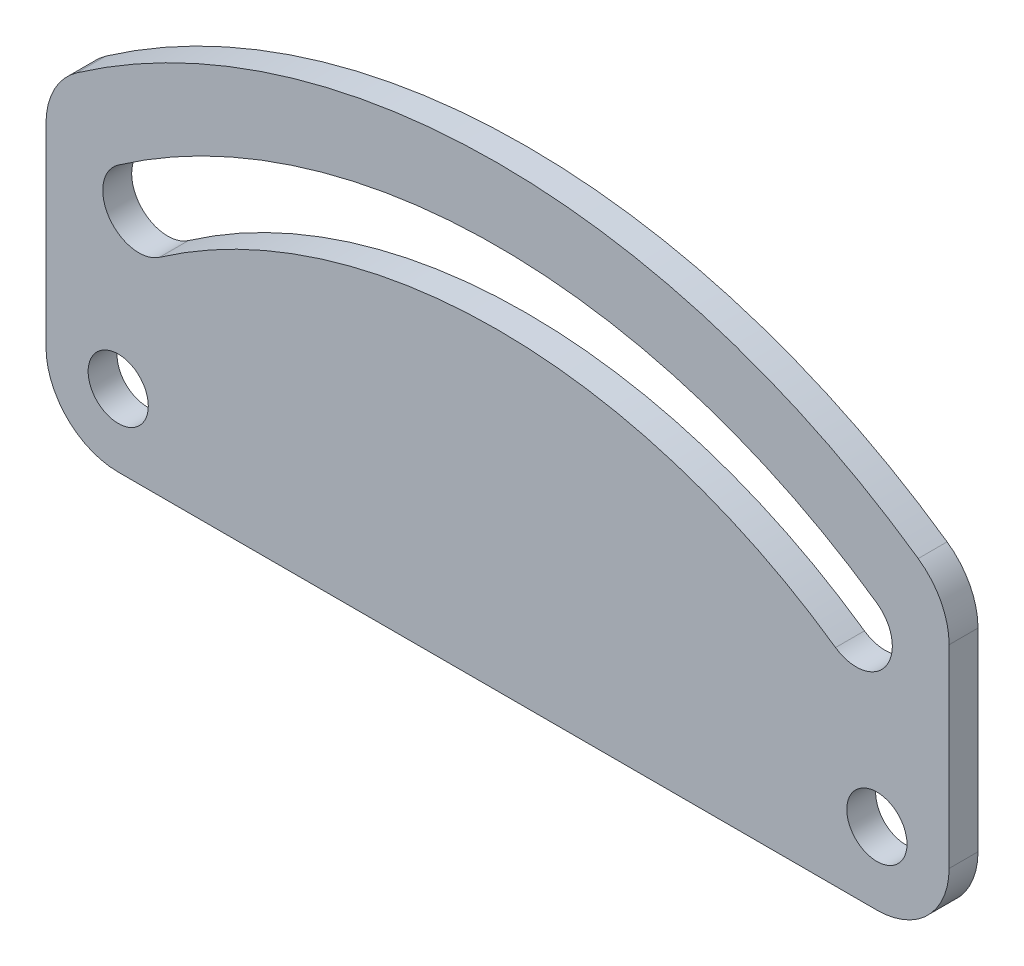
ISO-10303-21;
HEADER;
FILE_DESCRIPTION(('STEP AP214'),'2;1');
FILE_NAME('part.step','',(''),(''),'','','');
FILE_SCHEMA(('AUTOMOTIVE_DESIGN { 1 0 10303 214 1 1 1 1 }'));
ENDSEC;
DATA;
#1=APPLICATION_CONTEXT('core data for automotive mechanical design processes');
#2=APPLICATION_PROTOCOL_DEFINITION('international standard','automotive_design',2000,#1);
#3=PRODUCT_CONTEXT('',#1,'mechanical');
#4=PRODUCT('Part','Part','',(#3));
#5=PRODUCT_RELATED_PRODUCT_CATEGORY('part','',(#4));
#6=PRODUCT_DEFINITION_FORMATION('','',#4);
#7=PRODUCT_DEFINITION_CONTEXT('part definition',#1,'design');
#8=PRODUCT_DEFINITION('design','',#6,#7);
#9=PRODUCT_DEFINITION_SHAPE('','',#8);
#10=(LENGTH_UNIT() NAMED_UNIT(*) SI_UNIT(.MILLI.,.METRE.));
#11=(NAMED_UNIT(*) PLANE_ANGLE_UNIT() SI_UNIT($,.RADIAN.));
#12=(NAMED_UNIT(*) SI_UNIT($,.STERADIAN.) SOLID_ANGLE_UNIT());
#13=UNCERTAINTY_MEASURE_WITH_UNIT(LENGTH_MEASURE(1.E-05),#10,'distance_accuracy_value','');
#14=(GEOMETRIC_REPRESENTATION_CONTEXT(3) GLOBAL_UNCERTAINTY_ASSIGNED_CONTEXT((#13)) GLOBAL_UNIT_ASSIGNED_CONTEXT((#10,
#11,#12)) REPRESENTATION_CONTEXT('',''));
#15=CARTESIAN_POINT('',(0.,0.,0.));
#16=DIRECTION('',(0.,0.,1.));
#17=DIRECTION('',(1.,0.,0.));
#18=AXIS2_PLACEMENT_3D('',#15,#16,#17);
#19=CARTESIAN_POINT('',(73.0572121824321,23.3844748280358,-2.54));
#20=DIRECTION('',(0.,0.,1.));
#21=DIRECTION('',(1.,0.,0.));
#22=AXIS2_PLACEMENT_3D('',#19,#20,#21);
#23=CYLINDRICAL_SURFACE('',#22,6.35);
#24=CARTESIAN_POINT('',(73.0572121824321,23.3844748280358,0.));
#25=DIRECTION('',(0.,0.,1.));
#26=DIRECTION('',(1.,0.,0.));
#27=AXIS2_PLACEMENT_3D('',#24,#25,#26);
#28=CIRCLE('',#27,6.35);
#29=CARTESIAN_POINT('',(79.4072121824321,23.3844748280358,0.));
#30=VERTEX_POINT('',#29);
#31=CARTESIAN_POINT('',(76.6916603062949,28.5915168707843,0.));
#32=VERTEX_POINT('',#31);
#33=EDGE_CURVE('E174',#30,#32,#28,.T.);
#34=ORIENTED_EDGE('',*,*,#33,.F.);
#35=DIRECTION('',(0.,0.,1.));
#36=VECTOR('',#35,1.);
#37=CARTESIAN_POINT('',(79.4072121824321,23.3844748280358,-2.54));
#38=LINE('',#37,#36);
#39=CARTESIAN_POINT('',(79.4072121824321,23.3844748280358,-2.54));
#40=VERTEX_POINT('',#39);
#41=EDGE_CURVE('E11',#40,#30,#38,.T.);
#42=ORIENTED_EDGE('',*,*,#41,.F.);
#43=CARTESIAN_POINT('',(73.0572121824321,23.3844748280358,-2.54));
#44=DIRECTION('',(0.,0.,1.));
#45=DIRECTION('',(1.,0.,0.));
#46=AXIS2_PLACEMENT_3D('',#43,#44,#45);
#47=CIRCLE('',#46,6.35);
#48=CARTESIAN_POINT('',(76.6916603062949,28.5915168707843,-2.54));
#49=VERTEX_POINT('',#48);
#50=EDGE_CURVE('E242',#40,#49,#47,.T.);
#51=ORIENTED_EDGE('',*,*,#50,.T.);
#52=DIRECTION('',(0.,0.,1.));
#53=VECTOR('',#52,1.);
#54=CARTESIAN_POINT('',(76.6916603062949,28.5915168707843,-2.54));
#55=LINE('',#54,#53);
#56=EDGE_CURVE('E211',#49,#32,#55,.T.);
#57=ORIENTED_EDGE('',*,*,#56,.T.);
#58=EDGE_LOOP('',(#34,#42,#51,#57));
#59=FACE_BOUND('',#58,.T.);
#60=ADVANCED_FACE('F33',(#59),#23,.T.);
#61=CARTESIAN_POINT('',(79.4072121824321,-49.2660680671927,-2.54));
#62=DIRECTION('',(1.,0.,0.));
#63=DIRECTION('',(0.,0.,-1.));
#64=AXIS2_PLACEMENT_3D('',#61,#62,#63);
#65=PLANE('',#64);
#66=DIRECTION('',(0.,1.,0.));
#67=VECTOR('',#66,1.);
#68=CARTESIAN_POINT('',(79.4072121824321,-49.2660680671927,0.));
#69=LINE('',#68,#67);
#70=CARTESIAN_POINT('',(79.4072121824321,6.35000000000004,0.));
#71=VERTEX_POINT('',#70);
#72=EDGE_CURVE('E192',#71,#30,#69,.T.);
#73=ORIENTED_EDGE('',*,*,#72,.F.);
#74=DIRECTION('',(0.,0.,1.));
#75=VECTOR('',#74,1.);
#76=CARTESIAN_POINT('',(79.4072121824321,6.35000000000004,-2.54));
#77=LINE('',#76,#75);
#78=CARTESIAN_POINT('',(79.4072121824321,6.35000000000004,-2.54));
#79=VERTEX_POINT('',#78);
#80=EDGE_CURVE('E43',#79,#71,#77,.T.);
#81=ORIENTED_EDGE('',*,*,#80,.F.);
#82=DIRECTION('',(0.,1.,0.));
#83=VECTOR('',#82,1.);
#84=CARTESIAN_POINT('',(79.4072121824321,-49.2660680671927,-2.54));
#85=LINE('',#84,#83);
#86=EDGE_CURVE('E147',#79,#40,#85,.T.);
#87=ORIENTED_EDGE('',*,*,#86,.T.);
#88=ORIENTED_EDGE('',*,*,#41,.T.);
#89=EDGE_LOOP('',(#73,#81,#87,#88));
#90=FACE_BOUND('',#89,.T.);
#91=ADVANCED_FACE('F265',(#90),#65,.T.);
#92=CARTESIAN_POINT('',(73.0572121824321,6.35,-2.54));
#93=DIRECTION('',(0.,0.,1.));
#94=DIRECTION('',(1.,0.,0.));
#95=AXIS2_PLACEMENT_3D('',#92,#93,#94);
#96=CYLINDRICAL_SURFACE('',#95,6.35);
#97=CARTESIAN_POINT('',(73.0572121824321,6.35,0.));
#98=DIRECTION('',(0.,0.,1.));
#99=DIRECTION('',(1.,0.,0.));
#100=AXIS2_PLACEMENT_3D('',#97,#98,#99);
#101=CIRCLE('',#100,6.35);
#102=CARTESIAN_POINT('',(73.057212182432,0.,0.));
#103=VERTEX_POINT('',#102);
#104=EDGE_CURVE('E133',#103,#71,#101,.T.);
#105=ORIENTED_EDGE('',*,*,#104,.F.);
#106=DIRECTION('',(0.,0.,1.));
#107=VECTOR('',#106,1.);
#108=CARTESIAN_POINT('',(73.057212182432,0.,-2.54));
#109=LINE('',#108,#107);
#110=CARTESIAN_POINT('',(73.057212182432,0.,-2.54));
#111=VERTEX_POINT('',#110);
#112=EDGE_CURVE('E128',#111,#103,#109,.T.);
#113=ORIENTED_EDGE('',*,*,#112,.F.);
#114=CARTESIAN_POINT('',(73.0572121824321,6.35,-2.54));
#115=DIRECTION('',(0.,0.,1.));
#116=DIRECTION('',(1.,0.,0.));
#117=AXIS2_PLACEMENT_3D('',#114,#115,#116);
#118=CIRCLE('',#117,6.35);
#119=EDGE_CURVE('E131',#111,#79,#118,.T.);
#120=ORIENTED_EDGE('',*,*,#119,.T.);
#121=ORIENTED_EDGE('',*,*,#80,.T.);
#122=EDGE_LOOP('',(#105,#113,#120,#121));
#123=FACE_BOUND('',#122,.T.);
#124=ADVANCED_FACE('F130',(#123),#96,.T.);
#125=CARTESIAN_POINT('',(39.703606091216,0.,-2.54));
#126=DIRECTION('',(0.,-1.,0.));
#127=DIRECTION('',(0.,0.,-1.));
#128=AXIS2_PLACEMENT_3D('',#125,#126,#127);
#129=PLANE('',#128);
#130=DIRECTION('',(1.,0.,0.));
#131=VECTOR('',#130,1.);
#132=CARTESIAN_POINT('',(39.703606091216,0.,0.));
#133=LINE('',#132,#131);
#134=CARTESIAN_POINT('',(6.35000000000004,0.,0.));
#135=VERTEX_POINT('',#134);
#136=EDGE_CURVE('E189',#135,#103,#133,.T.);
#137=ORIENTED_EDGE('',*,*,#136,.F.);
#138=DIRECTION('',(0.,0.,1.));
#139=VECTOR('',#138,1.);
#140=CARTESIAN_POINT('',(6.35000000000004,0.,-2.54));
#141=LINE('',#140,#139);
#142=CARTESIAN_POINT('',(6.35000000000004,0.,-2.54));
#143=VERTEX_POINT('',#142);
#144=EDGE_CURVE('E138',#143,#135,#141,.T.);
#145=ORIENTED_EDGE('',*,*,#144,.F.);
#146=DIRECTION('',(1.,0.,0.));
#147=VECTOR('',#146,1.);
#148=CARTESIAN_POINT('',(39.703606091216,0.,-2.54));
#149=LINE('',#148,#147);
#150=EDGE_CURVE('E145',#143,#111,#149,.T.);
#151=ORIENTED_EDGE('',*,*,#150,.T.);
#152=ORIENTED_EDGE('',*,*,#112,.T.);
#153=EDGE_LOOP('',(#137,#145,#151,#152));
#154=FACE_BOUND('',#153,.T.);
#155=ADVANCED_FACE('F149',(#154),#129,.T.);
#156=CARTESIAN_POINT('',(6.35,6.35,-2.54));
#157=DIRECTION('',(0.,0.,1.));
#158=DIRECTION('',(1.,0.,0.));
#159=AXIS2_PLACEMENT_3D('',#156,#157,#158);
#160=CYLINDRICAL_SURFACE('',#159,6.35);
#161=CARTESIAN_POINT('',(6.35,6.35,0.));
#162=DIRECTION('',(0.,0.,1.));
#163=DIRECTION('',(1.,0.,0.));
#164=AXIS2_PLACEMENT_3D('',#161,#162,#163);
#165=CIRCLE('',#164,6.35);
#166=CARTESIAN_POINT('',(0.,6.35000000000004,0.));
#167=VERTEX_POINT('',#166);
#168=EDGE_CURVE('E186',#167,#135,#165,.T.);
#169=ORIENTED_EDGE('',*,*,#168,.F.);
#170=DIRECTION('',(0.,0.,1.));
#171=VECTOR('',#170,1.);
#172=CARTESIAN_POINT('',(0.,6.35000000000004,-2.54));
#173=LINE('',#172,#171);
#174=CARTESIAN_POINT('',(0.,6.35000000000004,-2.54));
#175=VERTEX_POINT('',#174);
#176=EDGE_CURVE('E204',#175,#167,#173,.T.);
#177=ORIENTED_EDGE('',*,*,#176,.F.);
#178=CARTESIAN_POINT('',(6.35,6.35,-2.54));
#179=DIRECTION('',(0.,0.,1.));
#180=DIRECTION('',(1.,0.,0.));
#181=AXIS2_PLACEMENT_3D('',#178,#179,#180);
#182=CIRCLE('',#181,6.35);
#183=EDGE_CURVE('E150',#175,#143,#182,.T.);
#184=ORIENTED_EDGE('',*,*,#183,.T.);
#185=ORIENTED_EDGE('',*,*,#144,.T.);
#186=EDGE_LOOP('',(#169,#177,#184,#185));
#187=FACE_BOUND('',#186,.T.);
#188=ADVANCED_FACE('F257',(#187),#160,.T.);
#189=CARTESIAN_POINT('',(0.,-49.2660680671927,-2.54));
#190=DIRECTION('',(-1.,0.,0.));
#191=DIRECTION('',(0.,0.,1.));
#192=AXIS2_PLACEMENT_3D('',#189,#190,#191);
#193=PLANE('',#192);
#194=DIRECTION('',(0.,-1.,0.));
#195=VECTOR('',#194,1.);
#196=CARTESIAN_POINT('',(0.,-49.2660680671927,0.));
#197=LINE('',#196,#195);
#198=CARTESIAN_POINT('',(0.,23.3844748280358,0.));
#199=VERTEX_POINT('',#198);
#200=EDGE_CURVE('E183',#199,#167,#197,.T.);
#201=ORIENTED_EDGE('',*,*,#200,.F.);
#202=DIRECTION('',(0.,0.,1.));
#203=VECTOR('',#202,1.);
#204=CARTESIAN_POINT('',(0.,23.3844748280358,-2.54));
#205=LINE('',#204,#203);
#206=CARTESIAN_POINT('',(0.,23.3844748280358,-2.54));
#207=VERTEX_POINT('',#206);
#208=EDGE_CURVE('E206',#207,#199,#205,.T.);
#209=ORIENTED_EDGE('',*,*,#208,.F.);
#210=DIRECTION('',(0.,-1.,0.));
#211=VECTOR('',#210,1.);
#212=CARTESIAN_POINT('',(0.,-49.2660680671927,-2.54));
#213=LINE('',#212,#211);
#214=EDGE_CURVE('E152',#207,#175,#213,.T.);
#215=ORIENTED_EDGE('',*,*,#214,.T.);
#216=ORIENTED_EDGE('',*,*,#176,.T.);
#217=EDGE_LOOP('',(#201,#209,#215,#216));
#218=FACE_BOUND('',#217,.T.);
#219=ADVANCED_FACE('F252',(#218),#193,.T.);
#220=CARTESIAN_POINT('',(6.35,23.3844748280358,-2.54));
#221=DIRECTION('',(0.,0.,1.));
#222=DIRECTION('',(1.,0.,0.));
#223=AXIS2_PLACEMENT_3D('',#220,#221,#222);
#224=CYLINDRICAL_SURFACE('',#223,6.35);
#225=CARTESIAN_POINT('',(6.35,23.3844748280358,0.));
#226=DIRECTION('',(0.,0.,1.));
#227=DIRECTION('',(1.,0.,0.));
#228=AXIS2_PLACEMENT_3D('',#225,#226,#227);
#229=CIRCLE('',#228,6.35);
#230=CARTESIAN_POINT('',(2.71555187613719,28.5915168707843,0.));
#231=VERTEX_POINT('',#230);
#232=EDGE_CURVE('E180',#199,#231,#229,.F.);
#233=ORIENTED_EDGE('',*,*,#232,.T.);
#234=DIRECTION('',(0.,0.,1.));
#235=VECTOR('',#234,1.);
#236=CARTESIAN_POINT('',(2.71555187613719,28.5915168707843,-2.54));
#237=LINE('',#236,#235);
#238=CARTESIAN_POINT('',(2.71555187613719,28.5915168707843,-2.54));
#239=VERTEX_POINT('',#238);
#240=EDGE_CURVE('E208',#239,#231,#237,.T.);
#241=ORIENTED_EDGE('',*,*,#240,.F.);
#242=CARTESIAN_POINT('',(6.35,23.3844748280358,-2.54));
#243=DIRECTION('',(0.,0.,1.));
#244=DIRECTION('',(1.,0.,0.));
#245=AXIS2_PLACEMENT_3D('',#242,#243,#244);
#246=CIRCLE('',#245,6.35);
#247=EDGE_CURVE('E246',#207,#239,#246,.F.);
#248=ORIENTED_EDGE('',*,*,#247,.F.);
#249=ORIENTED_EDGE('',*,*,#208,.T.);
#250=EDGE_LOOP('',(#233,#241,#248,#249));
#251=FACE_BOUND('',#250,.T.);
#252=ADVANCED_FACE('F261',(#251),#224,.T.);
#253=CARTESIAN_POINT('',(39.703606091216,-24.4009449318279,-2.54));
#254=DIRECTION('',(0.,0.,1.));
#255=DIRECTION('',(1.,0.,0.));
#256=AXIS2_PLACEMENT_3D('',#253,#254,#255);
#257=CYLINDRICAL_SURFACE('',#256,58.2744316224052);
#258=CARTESIAN_POINT('',(39.703606091216,-24.4009449318279,0.));
#259=DIRECTION('',(0.,0.,1.));
#260=DIRECTION('',(1.,0.,0.));
#261=AXIS2_PLACEMENT_3D('',#258,#259,#260);
#262=CIRCLE('',#261,58.2744316224052);
#263=CARTESIAN_POINT('',(6.35,23.3844748280358,0.));
#264=VERTEX_POINT('',#263);
#265=CARTESIAN_POINT('',(73.0572121824321,23.3844748280358,0.));
#266=VERTEX_POINT('',#265);
#267=EDGE_CURVE('E163',#264,#266,#262,.F.);
#268=ORIENTED_EDGE('',*,*,#267,.F.);
#269=DIRECTION('',(0.,0.,1.));
#270=VECTOR('',#269,1.);
#271=CARTESIAN_POINT('',(6.35,23.3844748280358,-2.54));
#272=LINE('',#271,#270);
#273=CARTESIAN_POINT('',(6.35,23.3844748280358,-2.54));
#274=VERTEX_POINT('',#273);
#275=EDGE_CURVE('E213',#274,#264,#272,.T.);
#276=ORIENTED_EDGE('',*,*,#275,.F.);
#277=CARTESIAN_POINT('',(39.703606091216,-24.4009449318279,-2.54));
#278=DIRECTION('',(0.,0.,1.));
#279=DIRECTION('',(1.,0.,0.));
#280=AXIS2_PLACEMENT_3D('',#277,#278,#279);
#281=CIRCLE('',#280,58.2744316224052);
#282=CARTESIAN_POINT('',(73.0572121824321,23.3844748280358,-2.54));
#283=VERTEX_POINT('',#282);
#284=EDGE_CURVE('E200',#274,#283,#281,.F.);
#285=ORIENTED_EDGE('',*,*,#284,.T.);
#286=DIRECTION('',(0.,0.,1.));
#287=VECTOR('',#286,1.);
#288=CARTESIAN_POINT('',(73.0572121824321,23.3844748280358,-2.54));
#289=LINE('',#288,#287);
#290=EDGE_CURVE('E37',#283,#266,#289,.T.);
#291=ORIENTED_EDGE('',*,*,#290,.T.);
#292=EDGE_LOOP('',(#268,#276,#285,#291));
#293=FACE_BOUND('',#292,.T.);
#294=ADVANCED_FACE('F35',(#293),#257,.F.);
#295=CARTESIAN_POINT('',(8.16722406193142,20.7809538066616,-2.54));
#296=DIRECTION('',(0.,0.,1.));
#297=DIRECTION('',(1.,0.,0.));
#298=AXIS2_PLACEMENT_3D('',#295,#296,#297);
#299=CYLINDRICAL_SURFACE('',#298,3.17500000000001);
#300=CARTESIAN_POINT('',(8.16722406193142,20.7809538066616,0.));
#301=DIRECTION('',(0.,0.,1.));
#302=DIRECTION('',(1.,0.,0.));
#303=AXIS2_PLACEMENT_3D('',#300,#301,#302);
#304=CIRCLE('',#303,3.17500000000001);
#305=CARTESIAN_POINT('',(9.98444812386283,18.1774327852874,0.));
#306=VERTEX_POINT('',#305);
#307=EDGE_CURVE('E171',#306,#264,#304,.F.);
#308=ORIENTED_EDGE('',*,*,#307,.F.);
#309=DIRECTION('',(0.,0.,1.));
#310=VECTOR('',#309,1.);
#311=CARTESIAN_POINT('',(9.98444812386283,18.1774327852874,-2.54));
#312=LINE('',#311,#310);
#313=CARTESIAN_POINT('',(9.98444812386283,18.1774327852874,-2.54));
#314=VERTEX_POINT('',#313);
#315=EDGE_CURVE('E215',#314,#306,#312,.T.);
#316=ORIENTED_EDGE('',*,*,#315,.F.);
#317=CARTESIAN_POINT('',(8.16722406193142,20.7809538066616,-2.54));
#318=DIRECTION('',(0.,0.,1.));
#319=DIRECTION('',(1.,0.,0.));
#320=AXIS2_PLACEMENT_3D('',#317,#318,#319);
#321=CIRCLE('',#320,3.17500000000001);
#322=EDGE_CURVE('E235',#314,#274,#321,.F.);
#323=ORIENTED_EDGE('',*,*,#322,.T.);
#324=ORIENTED_EDGE('',*,*,#275,.T.);
#325=EDGE_LOOP('',(#308,#316,#323,#324));
#326=FACE_BOUND('',#325,.T.);
#327=ADVANCED_FACE('F231',(#326),#299,.F.);
#328=CARTESIAN_POINT('',(39.703606091216,-24.4009449318278,-2.54));
#329=DIRECTION('',(0.,0.,1.));
#330=DIRECTION('',(1.,0.,0.));
#331=AXIS2_PLACEMENT_3D('',#328,#329,#330);
#332=CYLINDRICAL_SURFACE('',#331,51.9244316224052);
#333=CARTESIAN_POINT('',(39.703606091216,-24.4009449318278,0.));
#334=DIRECTION('',(0.,0.,1.));
#335=DIRECTION('',(1.,0.,0.));
#336=AXIS2_PLACEMENT_3D('',#333,#334,#335);
#337=CIRCLE('',#336,51.9244316224052);
#338=CARTESIAN_POINT('',(69.4227640585692,18.1774327852874,0.));
#339=VERTEX_POINT('',#338);
#340=EDGE_CURVE('E169',#306,#339,#337,.F.);
#341=ORIENTED_EDGE('',*,*,#340,.T.);
#342=DIRECTION('',(0.,0.,1.));
#343=VECTOR('',#342,1.);
#344=CARTESIAN_POINT('',(69.4227640585692,18.1774327852874,-2.54));
#345=LINE('',#344,#343);
#346=CARTESIAN_POINT('',(69.4227640585692,18.1774327852874,-2.54));
#347=VERTEX_POINT('',#346);
#348=EDGE_CURVE('E216',#347,#339,#345,.T.);
#349=ORIENTED_EDGE('',*,*,#348,.F.);
#350=CARTESIAN_POINT('',(39.703606091216,-24.4009449318278,-2.54));
#351=DIRECTION('',(0.,0.,1.));
#352=DIRECTION('',(1.,0.,0.));
#353=AXIS2_PLACEMENT_3D('',#350,#351,#352);
#354=CIRCLE('',#353,51.9244316224052);
#355=EDGE_CURVE('E237',#314,#347,#354,.F.);
#356=ORIENTED_EDGE('',*,*,#355,.F.);
#357=ORIENTED_EDGE('',*,*,#315,.T.);
#358=EDGE_LOOP('',(#341,#349,#356,#357));
#359=FACE_BOUND('',#358,.T.);
#360=ADVANCED_FACE('F277',(#359),#332,.T.);
#361=CARTESIAN_POINT('',(6.35,6.35,-2.54));
#362=DIRECTION('',(0.,0.,1.));
#363=DIRECTION('',(1.,0.,0.));
#364=AXIS2_PLACEMENT_3D('',#361,#362,#363);
#365=CYLINDRICAL_SURFACE('',#364,2.64547267668258);
#366=CARTESIAN_POINT('',(6.35,6.35,-2.54));
#367=DIRECTION('',(0.,0.,1.));
#368=DIRECTION('',(1.,0.,0.));
#369=AXIS2_PLACEMENT_3D('',#366,#367,#368);
#370=CIRCLE('',#369,2.64547267668258);
#371=CARTESIAN_POINT('',(8.99547267668258,6.35,-2.54));
#372=VERTEX_POINT('',#371);
#373=EDGE_CURVE('E157',#372,#372,#370,.T.);
#374=ORIENTED_EDGE('',*,*,#373,.F.);
#375=EDGE_LOOP('',(#374));
#376=FACE_BOUND('',#375,.T.);
#377=CARTESIAN_POINT('',(6.35,6.35,0.));
#378=DIRECTION('',(0.,0.,1.));
#379=DIRECTION('',(1.,0.,0.));
#380=AXIS2_PLACEMENT_3D('',#377,#378,#379);
#381=CIRCLE('',#380,2.64547267668258);
#382=CARTESIAN_POINT('',(8.99547267668258,6.35,0.));
#383=VERTEX_POINT('',#382);
#384=EDGE_CURVE('E195',#383,#383,#381,.T.);
#385=ORIENTED_EDGE('',*,*,#384,.T.);
#386=EDGE_LOOP('',(#385));
#387=FACE_BOUND('',#386,.T.);
#388=ADVANCED_FACE('F279',(#376,#387),#365,.F.);
#389=CARTESIAN_POINT('',(39.703606091216,-24.4009449318279,-2.54));
#390=DIRECTION('',(0.,0.,1.));
#391=DIRECTION('',(1.,0.,0.));
#392=AXIS2_PLACEMENT_3D('',#389,#390,#391);
#393=CYLINDRICAL_SURFACE('',#392,64.6244316224052);
#394=CARTESIAN_POINT('',(39.703606091216,-24.4009449318279,0.));
#395=DIRECTION('',(0.,0.,1.));
#396=DIRECTION('',(1.,0.,0.));
#397=AXIS2_PLACEMENT_3D('',#394,#395,#396);
#398=CIRCLE('',#397,64.6244316224052);
#399=EDGE_CURVE('E177',#231,#32,#398,.F.);
#400=ORIENTED_EDGE('',*,*,#399,.T.);
#401=ORIENTED_EDGE('',*,*,#56,.F.);
#402=CARTESIAN_POINT('',(39.703606091216,-24.4009449318279,-2.54));
#403=DIRECTION('',(0.,0.,1.));
#404=DIRECTION('',(1.,0.,0.));
#405=AXIS2_PLACEMENT_3D('',#402,#403,#404);
#406=CIRCLE('',#405,64.6244316224052);
#407=EDGE_CURVE('E244',#239,#49,#406,.F.);
#408=ORIENTED_EDGE('',*,*,#407,.F.);
#409=ORIENTED_EDGE('',*,*,#240,.T.);
#410=EDGE_LOOP('',(#400,#401,#408,#409));
#411=FACE_BOUND('',#410,.T.);
#412=ADVANCED_FACE('F263',(#411),#393,.T.);
#413=CARTESIAN_POINT('',(71.2399881205007,20.7809538066616,-2.54));
#414=DIRECTION('',(0.,0.,1.));
#415=DIRECTION('',(1.,0.,0.));
#416=AXIS2_PLACEMENT_3D('',#413,#414,#415);
#417=CYLINDRICAL_SURFACE('',#416,3.17500000000001);
#418=CARTESIAN_POINT('',(71.2399881205007,20.7809538066616,0.));
#419=DIRECTION('',(0.,0.,1.));
#420=DIRECTION('',(1.,0.,0.));
#421=AXIS2_PLACEMENT_3D('',#418,#419,#420);
#422=CIRCLE('',#421,3.17500000000001);
#423=EDGE_CURVE('E166',#339,#266,#422,.T.);
#424=ORIENTED_EDGE('',*,*,#423,.T.);
#425=ORIENTED_EDGE('',*,*,#290,.F.);
#426=CARTESIAN_POINT('',(71.2399881205007,20.7809538066616,-2.54));
#427=DIRECTION('',(0.,0.,1.));
#428=DIRECTION('',(1.,0.,0.));
#429=AXIS2_PLACEMENT_3D('',#426,#427,#428);
#430=CIRCLE('',#429,3.17500000000001);
#431=EDGE_CURVE('E103',#347,#283,#430,.T.);
#432=ORIENTED_EDGE('',*,*,#431,.F.);
#433=ORIENTED_EDGE('',*,*,#348,.T.);
#434=EDGE_LOOP('',(#424,#425,#432,#433));
#435=FACE_BOUND('',#434,.T.);
#436=ADVANCED_FACE('F224',(#435),#417,.F.);
#437=CARTESIAN_POINT('',(73.0572121824321,6.35,-2.54));
#438=DIRECTION('',(0.,0.,1.));
#439=DIRECTION('',(1.,0.,0.));
#440=AXIS2_PLACEMENT_3D('',#437,#438,#439);
#441=CYLINDRICAL_SURFACE('',#440,2.64547267668258);
#442=CARTESIAN_POINT('',(73.0572121824321,6.35,-2.54));
#443=DIRECTION('',(0.,0.,1.));
#444=DIRECTION('',(1.,0.,0.));
#445=AXIS2_PLACEMENT_3D('',#442,#443,#444);
#446=CIRCLE('',#445,2.64547267668258);
#447=CARTESIAN_POINT('',(75.7026848591147,6.35,-2.54));
#448=VERTEX_POINT('',#447);
#449=EDGE_CURVE('E160',#448,#448,#446,.T.);
#450=ORIENTED_EDGE('',*,*,#449,.F.);
#451=EDGE_LOOP('',(#450));
#452=FACE_BOUND('',#451,.T.);
#453=CARTESIAN_POINT('',(73.0572121824321,6.35,0.));
#454=DIRECTION('',(0.,0.,1.));
#455=DIRECTION('',(1.,0.,0.));
#456=AXIS2_PLACEMENT_3D('',#453,#454,#455);
#457=CIRCLE('',#456,2.64547267668258);
#458=CARTESIAN_POINT('',(75.7026848591147,6.35,0.));
#459=VERTEX_POINT('',#458);
#460=EDGE_CURVE('E198',#459,#459,#457,.T.);
#461=ORIENTED_EDGE('',*,*,#460,.T.);
#462=EDGE_LOOP('',(#461));
#463=FACE_BOUND('',#462,.T.);
#464=ADVANCED_FACE('F282',(#452,#463),#441,.F.);
#465=CARTESIAN_POINT('',(39.703606091216,-49.2660680671927,-2.54));
#466=DIRECTION('',(0.,0.,1.));
#467=DIRECTION('',(1.,0.,0.));
#468=AXIS2_PLACEMENT_3D('',#465,#466,#467);
#469=PLANE('',#468);
#470=ORIENTED_EDGE('',*,*,#284,.F.);
#471=ORIENTED_EDGE('',*,*,#322,.F.);
#472=ORIENTED_EDGE('',*,*,#355,.T.);
#473=ORIENTED_EDGE('',*,*,#431,.T.);
#474=EDGE_LOOP('',(#470,#471,#472,#473));
#475=FACE_BOUND('',#474,.T.);
#476=ORIENTED_EDGE('',*,*,#50,.F.);
#477=ORIENTED_EDGE('',*,*,#86,.F.);
#478=ORIENTED_EDGE('',*,*,#119,.F.);
#479=ORIENTED_EDGE('',*,*,#150,.F.);
#480=ORIENTED_EDGE('',*,*,#183,.F.);
#481=ORIENTED_EDGE('',*,*,#214,.F.);
#482=ORIENTED_EDGE('',*,*,#247,.T.);
#483=ORIENTED_EDGE('',*,*,#407,.T.);
#484=EDGE_LOOP('',(#476,#477,#478,#479,#480,#481,#482,#483));
#485=FACE_BOUND('',#484,.T.);
#486=ORIENTED_EDGE('',*,*,#373,.T.);
#487=EDGE_LOOP('',(#486));
#488=FACE_BOUND('',#487,.T.);
#489=ORIENTED_EDGE('',*,*,#449,.T.);
#490=EDGE_LOOP('',(#489));
#491=FACE_BOUND('',#490,.T.);
#492=ADVANCED_FACE('F142',(#475,#485,#488,#491),#469,.F.);
#493=CARTESIAN_POINT('',(39.703606091216,-49.2660680671927,0.));
#494=DIRECTION('',(0.,0.,1.));
#495=DIRECTION('',(1.,0.,0.));
#496=AXIS2_PLACEMENT_3D('',#493,#494,#495);
#497=PLANE('',#496);
#498=ORIENTED_EDGE('',*,*,#267,.T.);
#499=ORIENTED_EDGE('',*,*,#423,.F.);
#500=ORIENTED_EDGE('',*,*,#340,.F.);
#501=ORIENTED_EDGE('',*,*,#307,.T.);
#502=EDGE_LOOP('',(#498,#499,#500,#501));
#503=FACE_BOUND('',#502,.T.);
#504=ORIENTED_EDGE('',*,*,#33,.T.);
#505=ORIENTED_EDGE('',*,*,#399,.F.);
#506=ORIENTED_EDGE('',*,*,#232,.F.);
#507=ORIENTED_EDGE('',*,*,#200,.T.);
#508=ORIENTED_EDGE('',*,*,#168,.T.);
#509=ORIENTED_EDGE('',*,*,#136,.T.);
#510=ORIENTED_EDGE('',*,*,#104,.T.);
#511=ORIENTED_EDGE('',*,*,#72,.T.);
#512=EDGE_LOOP('',(#504,#505,#506,#507,#508,#509,#510,#511));
#513=FACE_BOUND('',#512,.T.);
#514=ORIENTED_EDGE('',*,*,#384,.F.);
#515=EDGE_LOOP('',(#514));
#516=FACE_BOUND('',#515,.T.);
#517=ORIENTED_EDGE('',*,*,#460,.F.);
#518=EDGE_LOOP('',(#517));
#519=FACE_BOUND('',#518,.T.);
#520=ADVANCED_FACE('F227',(#503,#513,#516,#519),#497,.T.);
#521=CLOSED_SHELL('',(#60,#91,#124,#155,#188,#219,#252,#294,#327,#360,#388,#412,#436,#464,#492,#520));
#522=MANIFOLD_SOLID_BREP('B2',#521);
#523=ADVANCED_BREP_SHAPE_REPRESENTATION('',(#18,#522),#14);
#524=SHAPE_DEFINITION_REPRESENTATION(#9,#523);
ENDSEC;
END-ISO-10303-21;
